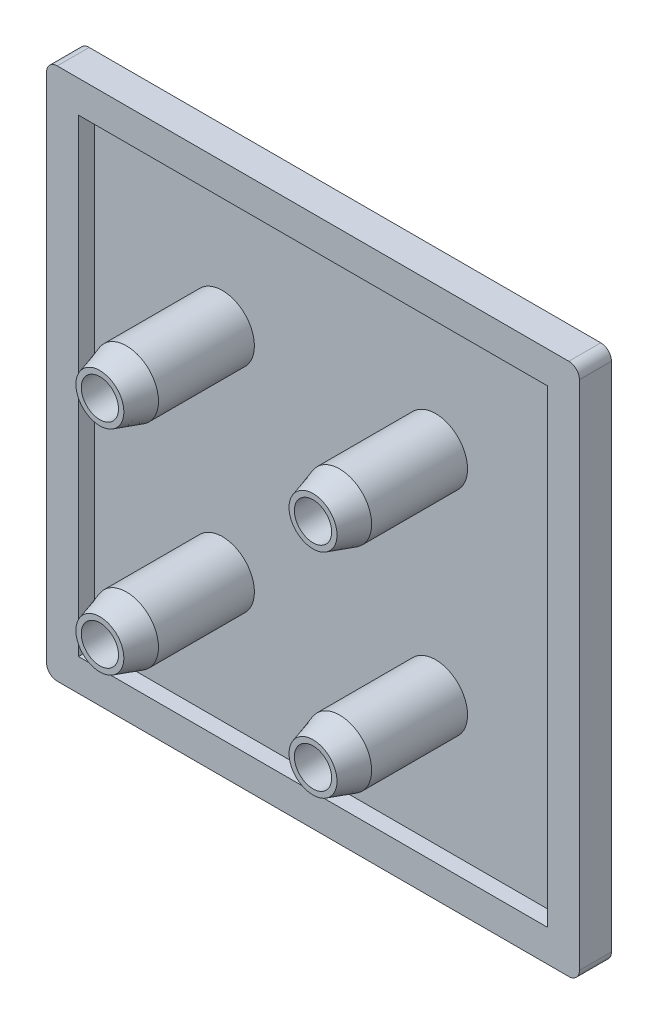
ISO-10303-21;
HEADER;
FILE_DESCRIPTION(('STEP AP214'),'2;1');
FILE_NAME('part.step','',(''),(''),'','','');
FILE_SCHEMA(('AUTOMOTIVE_DESIGN { 1 0 10303 214 1 1 1 1 }'));
ENDSEC;
DATA;
#1=APPLICATION_CONTEXT('core data for automotive mechanical design processes');
#2=APPLICATION_PROTOCOL_DEFINITION('international standard','automotive_design',2000,#1);
#3=PRODUCT_CONTEXT('',#1,'mechanical');
#4=PRODUCT('Part','Part','',(#3));
#5=PRODUCT_RELATED_PRODUCT_CATEGORY('part','',(#4));
#6=PRODUCT_DEFINITION_FORMATION('','',#4);
#7=PRODUCT_DEFINITION_CONTEXT('part definition',#1,'design');
#8=PRODUCT_DEFINITION('design','',#6,#7);
#9=PRODUCT_DEFINITION_SHAPE('','',#8);
#10=(LENGTH_UNIT() NAMED_UNIT(*) SI_UNIT(.MILLI.,.METRE.));
#11=(NAMED_UNIT(*) PLANE_ANGLE_UNIT() SI_UNIT($,.RADIAN.));
#12=(NAMED_UNIT(*) SI_UNIT($,.STERADIAN.) SOLID_ANGLE_UNIT());
#13=UNCERTAINTY_MEASURE_WITH_UNIT(LENGTH_MEASURE(1.E-05),#10,'distance_accuracy_value','');
#14=(GEOMETRIC_REPRESENTATION_CONTEXT(3) GLOBAL_UNCERTAINTY_ASSIGNED_CONTEXT((#13)) GLOBAL_UNIT_ASSIGNED_CONTEXT((#10,
#11,#12)) REPRESENTATION_CONTEXT('',''));
#15=CARTESIAN_POINT('',(0.,0.,0.));
#16=DIRECTION('',(0.,0.,1.));
#17=DIRECTION('',(1.,0.,0.));
#18=AXIS2_PLACEMENT_3D('',#15,#16,#17);
#19=CARTESIAN_POINT('',(0.,0.,-1.5));
#20=DIRECTION('',(0.,0.,1.));
#21=DIRECTION('',(1.,0.,0.));
#22=AXIS2_PLACEMENT_3D('',#19,#20,#21);
#23=PLANE('',#22);
#24=CARTESIAN_POINT('',(10.,-10.,-1.5));
#25=DIRECTION('',(0.,0.,1.));
#26=DIRECTION('',(1.,0.,0.));
#27=AXIS2_PLACEMENT_3D('',#24,#25,#26);
#28=CIRCLE('',#27,3.);
#29=CARTESIAN_POINT('',(13.,-10.,-1.5));
#30=VERTEX_POINT('',#29);
#31=EDGE_CURVE('E540',#30,#30,#28,.T.);
#32=ORIENTED_EDGE('',*,*,#31,.F.);
#33=EDGE_LOOP('',(#32));
#34=FACE_BOUND('',#33,.T.);
#35=CARTESIAN_POINT('',(-10.,10.,-1.5));
#36=DIRECTION('',(0.,0.,1.));
#37=DIRECTION('',(1.,0.,0.));
#38=AXIS2_PLACEMENT_3D('',#35,#36,#37);
#39=CIRCLE('',#38,3.);
#40=CARTESIAN_POINT('',(-7.,10.,-1.5));
#41=VERTEX_POINT('',#40);
#42=EDGE_CURVE('E570',#41,#41,#39,.T.);
#43=ORIENTED_EDGE('',*,*,#42,.F.);
#44=EDGE_LOOP('',(#43));
#45=FACE_BOUND('',#44,.T.);
#46=DIRECTION('',(0.,-1.,0.));
#47=VECTOR('',#46,1.);
#48=CARTESIAN_POINT('',(-22.,22.,-1.5));
#49=LINE('',#48,#47);
#50=CARTESIAN_POINT('',(-22.,22.,-1.5));
#51=VERTEX_POINT('',#50);
#52=CARTESIAN_POINT('',(-22.,-22.,-1.5));
#53=VERTEX_POINT('',#52);
#54=EDGE_CURVE('E242',#51,#53,#49,.T.);
#55=ORIENTED_EDGE('',*,*,#54,.T.);
#56=DIRECTION('',(1.,0.,0.));
#57=VECTOR('',#56,1.);
#58=CARTESIAN_POINT('',(-22.,-22.,-1.5));
#59=LINE('',#58,#57);
#60=CARTESIAN_POINT('',(22.,-22.,-1.5));
#61=VERTEX_POINT('',#60);
#62=EDGE_CURVE('E583',#53,#61,#59,.T.);
#63=ORIENTED_EDGE('',*,*,#62,.T.);
#64=DIRECTION('',(0.,1.,0.));
#65=VECTOR('',#64,1.);
#66=CARTESIAN_POINT('',(22.,-22.,-1.5));
#67=LINE('',#66,#65);
#68=CARTESIAN_POINT('',(22.,22.,-1.5));
#69=VERTEX_POINT('',#68);
#70=EDGE_CURVE('E585',#61,#69,#67,.T.);
#71=ORIENTED_EDGE('',*,*,#70,.T.);
#72=DIRECTION('',(-1.,0.,0.));
#73=VECTOR('',#72,1.);
#74=CARTESIAN_POINT('',(22.,22.,-1.5));
#75=LINE('',#74,#73);
#76=EDGE_CURVE('E236',#69,#51,#75,.T.);
#77=ORIENTED_EDGE('',*,*,#76,.T.);
#78=EDGE_LOOP('',(#55,#63,#71,#77));
#79=FACE_BOUND('',#78,.T.);
#80=CARTESIAN_POINT('',(10.,10.,-1.5));
#81=DIRECTION('',(0.,0.,1.));
#82=DIRECTION('',(1.,0.,0.));
#83=AXIS2_PLACEMENT_3D('',#80,#81,#82);
#84=CIRCLE('',#83,3.);
#85=CARTESIAN_POINT('',(13.,10.,-1.5));
#86=VERTEX_POINT('',#85);
#87=EDGE_CURVE('E555',#86,#86,#84,.T.);
#88=ORIENTED_EDGE('',*,*,#87,.F.);
#89=EDGE_LOOP('',(#88));
#90=FACE_BOUND('',#89,.T.);
#91=CARTESIAN_POINT('',(-10.,-10.,-1.5));
#92=DIRECTION('',(0.,0.,1.));
#93=DIRECTION('',(1.,0.,0.));
#94=AXIS2_PLACEMENT_3D('',#91,#92,#93);
#95=CIRCLE('',#94,3.);
#96=CARTESIAN_POINT('',(-7.,-10.,-1.5));
#97=VERTEX_POINT('',#96);
#98=EDGE_CURVE('E526',#97,#97,#95,.T.);
#99=ORIENTED_EDGE('',*,*,#98,.F.);
#100=EDGE_LOOP('',(#99));
#101=FACE_BOUND('',#100,.T.);
#102=ADVANCED_FACE('F35',(#34,#45,#79,#90,#101),#23,.T.);
#103=CARTESIAN_POINT('',(-24.0000000000015,24.0000000000015,-3.));
#104=DIRECTION('',(0.,0.,1.));
#105=DIRECTION('',(1.,0.,0.));
#106=AXIS2_PLACEMENT_3D('',#103,#104,#105);
#107=CYLINDRICAL_SURFACE('',#106,0.999999999998457);
#108=CARTESIAN_POINT('',(-24.0000000000015,24.0000000000015,0.));
#109=DIRECTION('',(0.,0.,1.));
#110=DIRECTION('',(1.,0.,0.));
#111=AXIS2_PLACEMENT_3D('',#108,#109,#110);
#112=CIRCLE('',#111,0.999999999998457);
#113=CARTESIAN_POINT('',(-24.,25.,0.));
#114=VERTEX_POINT('',#113);
#115=CARTESIAN_POINT('',(-25.,24.,0.));
#116=VERTEX_POINT('',#115);
#117=EDGE_CURVE('E146',#114,#116,#112,.T.);
#118=ORIENTED_EDGE('',*,*,#117,.F.);
#119=DIRECTION('',(0.,0.,1.));
#120=VECTOR('',#119,1.);
#121=CARTESIAN_POINT('',(-24.,25.,-3.));
#122=LINE('',#121,#120);
#123=CARTESIAN_POINT('',(-24.,25.,-3.));
#124=VERTEX_POINT('',#123);
#125=EDGE_CURVE('E11',#124,#114,#122,.T.);
#126=ORIENTED_EDGE('',*,*,#125,.F.);
#127=CARTESIAN_POINT('',(-24.0000000000015,24.0000000000015,-3.));
#128=DIRECTION('',(0.,0.,1.));
#129=DIRECTION('',(1.,0.,0.));
#130=AXIS2_PLACEMENT_3D('',#127,#128,#129);
#131=CIRCLE('',#130,0.999999999998457);
#132=CARTESIAN_POINT('',(-25.,24.,-3.));
#133=VERTEX_POINT('',#132);
#134=EDGE_CURVE('E167',#124,#133,#131,.T.);
#135=ORIENTED_EDGE('',*,*,#134,.T.);
#136=DIRECTION('',(0.,0.,1.));
#137=VECTOR('',#136,1.);
#138=CARTESIAN_POINT('',(-25.,24.,-3.));
#139=LINE('',#138,#137);
#140=EDGE_CURVE('E39',#133,#116,#139,.T.);
#141=ORIENTED_EDGE('',*,*,#140,.T.);
#142=EDGE_LOOP('',(#118,#126,#135,#141));
#143=FACE_BOUND('',#142,.T.);
#144=ADVANCED_FACE('F37',(#143),#107,.T.);
#145=CARTESIAN_POINT('',(24.,25.,-3.));
#146=DIRECTION('',(0.,1.,0.));
#147=DIRECTION('',(0.,0.,1.));
#148=AXIS2_PLACEMENT_3D('',#145,#146,#147);
#149=PLANE('',#148);
#150=DIRECTION('',(-1.,0.,0.));
#151=VECTOR('',#150,1.);
#152=CARTESIAN_POINT('',(24.,25.,0.));
#153=LINE('',#152,#151);
#154=CARTESIAN_POINT('',(24.,25.,0.));
#155=VERTEX_POINT('',#154);
#156=EDGE_CURVE('E165',#155,#114,#153,.T.);
#157=ORIENTED_EDGE('',*,*,#156,.F.);
#158=DIRECTION('',(0.,0.,1.));
#159=VECTOR('',#158,1.);
#160=CARTESIAN_POINT('',(24.,25.,-3.));
#161=LINE('',#160,#159);
#162=CARTESIAN_POINT('',(24.,25.,-3.));
#163=VERTEX_POINT('',#162);
#164=EDGE_CURVE('E44',#163,#155,#161,.T.);
#165=ORIENTED_EDGE('',*,*,#164,.F.);
#166=DIRECTION('',(-1.,0.,0.));
#167=VECTOR('',#166,1.);
#168=CARTESIAN_POINT('',(24.,25.,-3.));
#169=LINE('',#168,#167);
#170=EDGE_CURVE('E136',#163,#124,#169,.T.);
#171=ORIENTED_EDGE('',*,*,#170,.T.);
#172=ORIENTED_EDGE('',*,*,#125,.T.);
#173=EDGE_LOOP('',(#157,#165,#171,#172));
#174=FACE_BOUND('',#173,.T.);
#175=ADVANCED_FACE('F179',(#174),#149,.T.);
#176=CARTESIAN_POINT('',(24.0000000000015,24.0000000000015,-3.));
#177=DIRECTION('',(0.,0.,1.));
#178=DIRECTION('',(1.,0.,0.));
#179=AXIS2_PLACEMENT_3D('',#176,#177,#178);
#180=CYLINDRICAL_SURFACE('',#179,0.999999999998457);
#181=CARTESIAN_POINT('',(24.0000000000015,24.0000000000015,0.));
#182=DIRECTION('',(0.,0.,1.));
#183=DIRECTION('',(1.,0.,0.));
#184=AXIS2_PLACEMENT_3D('',#181,#182,#183);
#185=CIRCLE('',#184,0.999999999998457);
#186=CARTESIAN_POINT('',(25.,24.,0.));
#187=VERTEX_POINT('',#186);
#188=EDGE_CURVE('E123',#187,#155,#185,.T.);
#189=ORIENTED_EDGE('',*,*,#188,.F.);
#190=DIRECTION('',(0.,0.,1.));
#191=VECTOR('',#190,1.);
#192=CARTESIAN_POINT('',(25.,24.,-3.));
#193=LINE('',#192,#191);
#194=CARTESIAN_POINT('',(25.,24.,-3.));
#195=VERTEX_POINT('',#194);
#196=EDGE_CURVE('E117',#195,#187,#193,.T.);
#197=ORIENTED_EDGE('',*,*,#196,.F.);
#198=CARTESIAN_POINT('',(24.0000000000015,24.0000000000015,-3.));
#199=DIRECTION('',(0.,0.,1.));
#200=DIRECTION('',(1.,0.,0.));
#201=AXIS2_PLACEMENT_3D('',#198,#199,#200);
#202=CIRCLE('',#201,0.999999999998457);
#203=EDGE_CURVE('E120',#195,#163,#202,.T.);
#204=ORIENTED_EDGE('',*,*,#203,.T.);
#205=ORIENTED_EDGE('',*,*,#164,.T.);
#206=EDGE_LOOP('',(#189,#197,#204,#205));
#207=FACE_BOUND('',#206,.T.);
#208=ADVANCED_FACE('F119',(#207),#180,.T.);
#209=CARTESIAN_POINT('',(25.,-24.,-3.));
#210=DIRECTION('',(1.,0.,0.));
#211=DIRECTION('',(0.,0.,-1.));
#212=AXIS2_PLACEMENT_3D('',#209,#210,#211);
#213=PLANE('',#212);
#214=DIRECTION('',(0.,1.,0.));
#215=VECTOR('',#214,1.);
#216=CARTESIAN_POINT('',(25.,-24.,0.));
#217=LINE('',#216,#215);
#218=CARTESIAN_POINT('',(25.,-24.,0.));
#219=VERTEX_POINT('',#218);
#220=EDGE_CURVE('E162',#219,#187,#217,.T.);
#221=ORIENTED_EDGE('',*,*,#220,.F.);
#222=DIRECTION('',(0.,0.,1.));
#223=VECTOR('',#222,1.);
#224=CARTESIAN_POINT('',(25.,-24.,-3.));
#225=LINE('',#224,#223);
#226=CARTESIAN_POINT('',(25.,-24.,-3.));
#227=VERTEX_POINT('',#226);
#228=EDGE_CURVE('E128',#227,#219,#225,.T.);
#229=ORIENTED_EDGE('',*,*,#228,.F.);
#230=DIRECTION('',(0.,1.,0.));
#231=VECTOR('',#230,1.);
#232=CARTESIAN_POINT('',(25.,-24.,-3.));
#233=LINE('',#232,#231);
#234=EDGE_CURVE('E134',#227,#195,#233,.T.);
#235=ORIENTED_EDGE('',*,*,#234,.T.);
#236=ORIENTED_EDGE('',*,*,#196,.T.);
#237=EDGE_LOOP('',(#221,#229,#235,#236));
#238=FACE_BOUND('',#237,.T.);
#239=ADVANCED_FACE('F138',(#238),#213,.T.);
#240=CARTESIAN_POINT('',(24.0000000000015,-24.0000000000015,-3.));
#241=DIRECTION('',(0.,0.,1.));
#242=DIRECTION('',(1.,0.,0.));
#243=AXIS2_PLACEMENT_3D('',#240,#241,#242);
#244=CYLINDRICAL_SURFACE('',#243,0.999999999998457);
#245=CARTESIAN_POINT('',(24.0000000000015,-24.0000000000015,0.));
#246=DIRECTION('',(0.,0.,1.));
#247=DIRECTION('',(1.,0.,0.));
#248=AXIS2_PLACEMENT_3D('',#245,#246,#247);
#249=CIRCLE('',#248,0.999999999998457);
#250=CARTESIAN_POINT('',(24.,-25.,0.));
#251=VERTEX_POINT('',#250);
#252=EDGE_CURVE('E159',#251,#219,#249,.T.);
#253=ORIENTED_EDGE('',*,*,#252,.F.);
#254=DIRECTION('',(0.,0.,1.));
#255=VECTOR('',#254,1.);
#256=CARTESIAN_POINT('',(24.,-25.,-3.));
#257=LINE('',#256,#255);
#258=CARTESIAN_POINT('',(24.,-25.,-3.));
#259=VERTEX_POINT('',#258);
#260=EDGE_CURVE('E171',#259,#251,#257,.T.);
#261=ORIENTED_EDGE('',*,*,#260,.F.);
#262=CARTESIAN_POINT('',(24.0000000000015,-24.0000000000015,-3.));
#263=DIRECTION('',(0.,0.,1.));
#264=DIRECTION('',(1.,0.,0.));
#265=AXIS2_PLACEMENT_3D('',#262,#263,#264);
#266=CIRCLE('',#265,0.999999999998457);
#267=EDGE_CURVE('E139',#259,#227,#266,.T.);
#268=ORIENTED_EDGE('',*,*,#267,.T.);
#269=ORIENTED_EDGE('',*,*,#228,.T.);
#270=EDGE_LOOP('',(#253,#261,#268,#269));
#271=FACE_BOUND('',#270,.T.);
#272=ADVANCED_FACE('F267',(#271),#244,.T.);
#273=CARTESIAN_POINT('',(-24.,-25.,-3.));
#274=DIRECTION('',(0.,-1.,0.));
#275=DIRECTION('',(0.,0.,-1.));
#276=AXIS2_PLACEMENT_3D('',#273,#274,#275);
#277=PLANE('',#276);
#278=DIRECTION('',(1.,0.,0.));
#279=VECTOR('',#278,1.);
#280=CARTESIAN_POINT('',(-24.,-25.,0.));
#281=LINE('',#280,#279);
#282=CARTESIAN_POINT('',(-24.,-25.,0.));
#283=VERTEX_POINT('',#282);
#284=EDGE_CURVE('E156',#283,#251,#281,.T.);
#285=ORIENTED_EDGE('',*,*,#284,.F.);
#286=DIRECTION('',(0.,0.,1.));
#287=VECTOR('',#286,1.);
#288=CARTESIAN_POINT('',(-24.,-25.,-3.));
#289=LINE('',#288,#287);
#290=CARTESIAN_POINT('',(-24.,-25.,-3.));
#291=VERTEX_POINT('',#290);
#292=EDGE_CURVE('E173',#291,#283,#289,.T.);
#293=ORIENTED_EDGE('',*,*,#292,.F.);
#294=DIRECTION('',(1.,0.,0.));
#295=VECTOR('',#294,1.);
#296=CARTESIAN_POINT('',(-24.,-25.,-3.));
#297=LINE('',#296,#295);
#298=EDGE_CURVE('E141',#291,#259,#297,.T.);
#299=ORIENTED_EDGE('',*,*,#298,.T.);
#300=ORIENTED_EDGE('',*,*,#260,.T.);
#301=EDGE_LOOP('',(#285,#293,#299,#300));
#302=FACE_BOUND('',#301,.T.);
#303=ADVANCED_FACE('F261',(#302),#277,.T.);
#304=CARTESIAN_POINT('',(-24.0000000000015,-24.0000000000015,-3.));
#305=DIRECTION('',(0.,0.,1.));
#306=DIRECTION('',(1.,0.,0.));
#307=AXIS2_PLACEMENT_3D('',#304,#305,#306);
#308=CYLINDRICAL_SURFACE('',#307,0.999999999998457);
#309=CARTESIAN_POINT('',(-24.0000000000015,-24.0000000000015,0.));
#310=DIRECTION('',(0.,0.,1.));
#311=DIRECTION('',(1.,0.,0.));
#312=AXIS2_PLACEMENT_3D('',#309,#310,#311);
#313=CIRCLE('',#312,0.999999999998457);
#314=CARTESIAN_POINT('',(-25.,-24.,0.));
#315=VERTEX_POINT('',#314);
#316=EDGE_CURVE('E153',#315,#283,#313,.T.);
#317=ORIENTED_EDGE('',*,*,#316,.F.);
#318=DIRECTION('',(0.,0.,1.));
#319=VECTOR('',#318,1.);
#320=CARTESIAN_POINT('',(-25.,-24.,-3.));
#321=LINE('',#320,#319);
#322=CARTESIAN_POINT('',(-25.,-24.,-3.));
#323=VERTEX_POINT('',#322);
#324=EDGE_CURVE('E174',#323,#315,#321,.T.);
#325=ORIENTED_EDGE('',*,*,#324,.F.);
#326=CARTESIAN_POINT('',(-24.0000000000015,-24.0000000000015,-3.));
#327=DIRECTION('',(0.,0.,1.));
#328=DIRECTION('',(1.,0.,0.));
#329=AXIS2_PLACEMENT_3D('',#326,#327,#328);
#330=CIRCLE('',#329,0.999999999998457);
#331=EDGE_CURVE('E255',#323,#291,#330,.T.);
#332=ORIENTED_EDGE('',*,*,#331,.T.);
#333=ORIENTED_EDGE('',*,*,#292,.T.);
#334=EDGE_LOOP('',(#317,#325,#332,#333));
#335=FACE_BOUND('',#334,.T.);
#336=ADVANCED_FACE('F265',(#335),#308,.T.);
#337=CARTESIAN_POINT('',(-25.,24.,-3.));
#338=DIRECTION('',(-1.,0.,0.));
#339=DIRECTION('',(0.,0.,1.));
#340=AXIS2_PLACEMENT_3D('',#337,#338,#339);
#341=PLANE('',#340);
#342=DIRECTION('',(0.,-1.,0.));
#343=VECTOR('',#342,1.);
#344=CARTESIAN_POINT('',(-25.,24.,0.));
#345=LINE('',#344,#343);
#346=EDGE_CURVE('E149',#116,#315,#345,.T.);
#347=ORIENTED_EDGE('',*,*,#346,.F.);
#348=ORIENTED_EDGE('',*,*,#140,.F.);
#349=DIRECTION('',(0.,-1.,0.));
#350=VECTOR('',#349,1.);
#351=CARTESIAN_POINT('',(-25.,24.,-3.));
#352=LINE('',#351,#350);
#353=EDGE_CURVE('E253',#133,#323,#352,.T.);
#354=ORIENTED_EDGE('',*,*,#353,.T.);
#355=ORIENTED_EDGE('',*,*,#324,.T.);
#356=EDGE_LOOP('',(#347,#348,#354,#355));
#357=FACE_BOUND('',#356,.T.);
#358=ADVANCED_FACE('F176',(#357),#341,.T.);
#359=CARTESIAN_POINT('',(-24.0000000000015,24.0000000000015,-3.));
#360=DIRECTION('',(0.,0.,1.));
#361=DIRECTION('',(1.,0.,0.));
#362=AXIS2_PLACEMENT_3D('',#359,#360,#361);
#363=PLANE('',#362);
#364=ORIENTED_EDGE('',*,*,#134,.F.);
#365=ORIENTED_EDGE('',*,*,#170,.F.);
#366=ORIENTED_EDGE('',*,*,#203,.F.);
#367=ORIENTED_EDGE('',*,*,#234,.F.);
#368=ORIENTED_EDGE('',*,*,#267,.F.);
#369=ORIENTED_EDGE('',*,*,#298,.F.);
#370=ORIENTED_EDGE('',*,*,#331,.F.);
#371=ORIENTED_EDGE('',*,*,#353,.F.);
#372=EDGE_LOOP('',(#364,#365,#366,#367,#368,#369,#370,#371));
#373=FACE_BOUND('',#372,.T.);
#374=ADVANCED_FACE('F132',(#373),#363,.F.);
#375=CARTESIAN_POINT('',(-24.0000000000015,24.0000000000015,0.));
#376=DIRECTION('',(0.,0.,1.));
#377=DIRECTION('',(1.,0.,0.));
#378=AXIS2_PLACEMENT_3D('',#375,#376,#377);
#379=PLANE('',#378);
#380=DIRECTION('',(0.,-1.,0.));
#381=VECTOR('',#380,1.);
#382=CARTESIAN_POINT('',(-22.,22.,0.));
#383=LINE('',#382,#381);
#384=CARTESIAN_POINT('',(-22.,22.,0.));
#385=VERTEX_POINT('',#384);
#386=CARTESIAN_POINT('',(-22.,-22.,0.));
#387=VERTEX_POINT('',#386);
#388=EDGE_CURVE('E52',#385,#387,#383,.T.);
#389=ORIENTED_EDGE('',*,*,#388,.F.);
#390=DIRECTION('',(-1.,0.,0.));
#391=VECTOR('',#390,1.);
#392=CARTESIAN_POINT('',(22.,22.,0.));
#393=LINE('',#392,#391);
#394=CARTESIAN_POINT('',(22.,22.,0.));
#395=VERTEX_POINT('',#394);
#396=EDGE_CURVE('E224',#395,#385,#393,.T.);
#397=ORIENTED_EDGE('',*,*,#396,.F.);
#398=DIRECTION('',(0.,1.,0.));
#399=VECTOR('',#398,1.);
#400=CARTESIAN_POINT('',(22.,-22.,0.));
#401=LINE('',#400,#399);
#402=CARTESIAN_POINT('',(22.,-22.,0.));
#403=VERTEX_POINT('',#402);
#404=EDGE_CURVE('E230',#403,#395,#401,.T.);
#405=ORIENTED_EDGE('',*,*,#404,.F.);
#406=DIRECTION('',(1.,0.,0.));
#407=VECTOR('',#406,1.);
#408=CARTESIAN_POINT('',(-22.,-22.,0.));
#409=LINE('',#408,#407);
#410=EDGE_CURVE('E226',#387,#403,#409,.T.);
#411=ORIENTED_EDGE('',*,*,#410,.F.);
#412=EDGE_LOOP('',(#389,#397,#405,#411));
#413=FACE_BOUND('',#412,.T.);
#414=ORIENTED_EDGE('',*,*,#117,.T.);
#415=ORIENTED_EDGE('',*,*,#346,.T.);
#416=ORIENTED_EDGE('',*,*,#316,.T.);
#417=ORIENTED_EDGE('',*,*,#284,.T.);
#418=ORIENTED_EDGE('',*,*,#252,.T.);
#419=ORIENTED_EDGE('',*,*,#220,.T.);
#420=ORIENTED_EDGE('',*,*,#188,.T.);
#421=ORIENTED_EDGE('',*,*,#156,.T.);
#422=EDGE_LOOP('',(#414,#415,#416,#417,#418,#419,#420,#421));
#423=FACE_BOUND('',#422,.T.);
#424=ADVANCED_FACE('F178',(#413,#423),#379,.T.);
#425=CARTESIAN_POINT('',(-22.,22.,-1.5));
#426=DIRECTION('',(-1.,0.,0.));
#427=DIRECTION('',(0.,0.,1.));
#428=AXIS2_PLACEMENT_3D('',#425,#426,#427);
#429=PLANE('',#428);
#430=ORIENTED_EDGE('',*,*,#388,.T.);
#431=DIRECTION('',(0.,0.,1.));
#432=VECTOR('',#431,1.);
#433=CARTESIAN_POINT('',(-22.,-22.,-1.5));
#434=LINE('',#433,#432);
#435=EDGE_CURVE('E250',#53,#387,#434,.T.);
#436=ORIENTED_EDGE('',*,*,#435,.F.);
#437=ORIENTED_EDGE('',*,*,#54,.F.);
#438=DIRECTION('',(0.,0.,1.));
#439=VECTOR('',#438,1.);
#440=CARTESIAN_POINT('',(-22.,22.,-1.5));
#441=LINE('',#440,#439);
#442=EDGE_CURVE('E150',#51,#385,#441,.T.);
#443=ORIENTED_EDGE('',*,*,#442,.T.);
#444=EDGE_LOOP('',(#430,#436,#437,#443));
#445=FACE_BOUND('',#444,.T.);
#446=ADVANCED_FACE('F203',(#445),#429,.F.);
#447=CARTESIAN_POINT('',(22.,22.,-1.5));
#448=DIRECTION('',(0.,1.,0.));
#449=DIRECTION('',(0.,0.,1.));
#450=AXIS2_PLACEMENT_3D('',#447,#448,#449);
#451=PLANE('',#450);
#452=ORIENTED_EDGE('',*,*,#396,.T.);
#453=ORIENTED_EDGE('',*,*,#442,.F.);
#454=ORIENTED_EDGE('',*,*,#76,.F.);
#455=DIRECTION('',(0.,0.,1.));
#456=VECTOR('',#455,1.);
#457=CARTESIAN_POINT('',(22.,22.,-1.5));
#458=LINE('',#457,#456);
#459=EDGE_CURVE('E244',#69,#395,#458,.T.);
#460=ORIENTED_EDGE('',*,*,#459,.T.);
#461=EDGE_LOOP('',(#452,#453,#454,#460));
#462=FACE_BOUND('',#461,.T.);
#463=ADVANCED_FACE('F199',(#462),#451,.F.);
#464=CARTESIAN_POINT('',(22.,-22.,-1.5));
#465=DIRECTION('',(1.,0.,0.));
#466=DIRECTION('',(0.,0.,-1.));
#467=AXIS2_PLACEMENT_3D('',#464,#465,#466);
#468=PLANE('',#467);
#469=ORIENTED_EDGE('',*,*,#404,.T.);
#470=ORIENTED_EDGE('',*,*,#459,.F.);
#471=ORIENTED_EDGE('',*,*,#70,.F.);
#472=DIRECTION('',(0.,0.,1.));
#473=VECTOR('',#472,1.);
#474=CARTESIAN_POINT('',(22.,-22.,-1.5));
#475=LINE('',#474,#473);
#476=EDGE_CURVE('E247',#61,#403,#475,.T.);
#477=ORIENTED_EDGE('',*,*,#476,.T.);
#478=EDGE_LOOP('',(#469,#470,#471,#477));
#479=FACE_BOUND('',#478,.T.);
#480=ADVANCED_FACE('F202',(#479),#468,.F.);
#481=CARTESIAN_POINT('',(-22.,-22.,-1.5));
#482=DIRECTION('',(0.,-1.,0.));
#483=DIRECTION('',(0.,0.,-1.));
#484=AXIS2_PLACEMENT_3D('',#481,#482,#483);
#485=PLANE('',#484);
#486=ORIENTED_EDGE('',*,*,#410,.T.);
#487=ORIENTED_EDGE('',*,*,#476,.F.);
#488=ORIENTED_EDGE('',*,*,#62,.F.);
#489=ORIENTED_EDGE('',*,*,#435,.T.);
#490=EDGE_LOOP('',(#486,#487,#488,#489));
#491=FACE_BOUND('',#490,.T.);
#492=ADVANCED_FACE('F207',(#491),#485,.F.);
#493=CARTESIAN_POINT('',(-10.,10.,0.));
#494=DIRECTION('',(0.,0.,-1.));
#495=DIRECTION('',(-1.,0.,0.));
#496=AXIS2_PLACEMENT_3D('',#493,#494,#495);
#497=PLANE('',#496);
#498=CARTESIAN_POINT('',(-10.,10.,0.));
#499=DIRECTION('',(0.,0.,1.));
#500=DIRECTION('',(1.,0.,0.));
#501=AXIS2_PLACEMENT_3D('',#498,#499,#500);
#502=CIRCLE('',#501,1.75);
#503=CARTESIAN_POINT('',(-8.25,10.,0.));
#504=VERTEX_POINT('',#503);
#505=EDGE_CURVE('E228',#504,#504,#502,.T.);
#506=ORIENTED_EDGE('',*,*,#505,.T.);
#507=EDGE_LOOP('',(#506));
#508=FACE_BOUND('',#507,.T.);
#509=ADVANCED_FACE('F197',(#508),#497,.F.);
#510=CARTESIAN_POINT('',(-10.,10.,-1.5));
#511=DIRECTION('',(0.,0.,1.));
#512=DIRECTION('',(1.,0.,0.));
#513=AXIS2_PLACEMENT_3D('',#510,#511,#512);
#514=CYLINDRICAL_SURFACE('',#513,1.75);
#515=ORIENTED_EDGE('',*,*,#505,.F.);
#516=EDGE_LOOP('',(#515));
#517=FACE_BOUND('',#516,.T.);
#518=CARTESIAN_POINT('',(-10.,10.,10.));
#519=DIRECTION('',(0.,0.,1.));
#520=DIRECTION('',(1.,0.,0.));
#521=AXIS2_PLACEMENT_3D('',#518,#519,#520);
#522=CIRCLE('',#521,1.75);
#523=CARTESIAN_POINT('',(-8.25,10.,10.));
#524=VERTEX_POINT('',#523);
#525=EDGE_CURVE('E233',#524,#524,#522,.T.);
#526=ORIENTED_EDGE('',*,*,#525,.T.);
#527=EDGE_LOOP('',(#526));
#528=FACE_BOUND('',#527,.T.);
#529=ADVANCED_FACE('F324',(#517,#528),#514,.F.);
#530=CARTESIAN_POINT('',(-10.,11.75,10.));
#531=DIRECTION('',(0.,0.,-1.));
#532=DIRECTION('',(-1.,0.,0.));
#533=AXIS2_PLACEMENT_3D('',#530,#531,#532);
#534=PLANE('',#533);
#535=ORIENTED_EDGE('',*,*,#525,.F.);
#536=EDGE_LOOP('',(#535));
#537=FACE_BOUND('',#536,.T.);
#538=CARTESIAN_POINT('',(-10.,10.,10.));
#539=DIRECTION('',(0.,0.,1.));
#540=DIRECTION('',(1.,0.,0.));
#541=AXIS2_PLACEMENT_3D('',#538,#539,#540);
#542=CIRCLE('',#541,2.25);
#543=CARTESIAN_POINT('',(-7.75,10.,10.));
#544=VERTEX_POINT('',#543);
#545=EDGE_CURVE('E576',#544,#544,#542,.T.);
#546=ORIENTED_EDGE('',*,*,#545,.T.);
#547=EDGE_LOOP('',(#546));
#548=FACE_BOUND('',#547,.T.);
#549=ADVANCED_FACE('F333',(#537,#548),#534,.F.);
#550=CARTESIAN_POINT('',(-10.,10.,7.5));
#551=DIRECTION('',(0.,0.,-1.));
#552=DIRECTION('',(-1.,0.,0.));
#553=AXIS2_PLACEMENT_3D('',#550,#551,#552);
#554=CONICAL_SURFACE('',#553,3.,0.291456794477867);
#555=ORIENTED_EDGE('',*,*,#545,.F.);
#556=EDGE_LOOP('',(#555));
#557=FACE_BOUND('',#556,.T.);
#558=CARTESIAN_POINT('',(-10.,10.,7.5));
#559=DIRECTION('',(0.,0.,1.));
#560=DIRECTION('',(1.,0.,0.));
#561=AXIS2_PLACEMENT_3D('',#558,#559,#560);
#562=CIRCLE('',#561,3.);
#563=CARTESIAN_POINT('',(-7.,10.,7.5));
#564=VERTEX_POINT('',#563);
#565=EDGE_CURVE('E573',#564,#564,#562,.T.);
#566=ORIENTED_EDGE('',*,*,#565,.T.);
#567=EDGE_LOOP('',(#566));
#568=FACE_BOUND('',#567,.T.);
#569=ADVANCED_FACE('F342',(#557,#568),#554,.T.);
#570=CARTESIAN_POINT('',(-10.,10.,-1.5));
#571=DIRECTION('',(0.,0.,1.));
#572=DIRECTION('',(1.,0.,0.));
#573=AXIS2_PLACEMENT_3D('',#570,#571,#572);
#574=CYLINDRICAL_SURFACE('',#573,3.);
#575=ORIENTED_EDGE('',*,*,#565,.F.);
#576=EDGE_LOOP('',(#575));
#577=FACE_BOUND('',#576,.T.);
#578=ORIENTED_EDGE('',*,*,#42,.T.);
#579=EDGE_LOOP('',(#578));
#580=FACE_BOUND('',#579,.T.);
#581=ADVANCED_FACE('F352',(#577,#580),#574,.T.);
#582=CARTESIAN_POINT('',(10.,10.,0.));
#583=DIRECTION('',(0.,0.,-1.));
#584=DIRECTION('',(-1.,0.,0.));
#585=AXIS2_PLACEMENT_3D('',#582,#583,#584);
#586=PLANE('',#585);
#587=CARTESIAN_POINT('',(10.,10.,0.));
#588=DIRECTION('',(0.,0.,1.));
#589=DIRECTION('',(1.,0.,0.));
#590=AXIS2_PLACEMENT_3D('',#587,#588,#589);
#591=CIRCLE('',#590,1.75);
#592=CARTESIAN_POINT('',(11.75,10.,0.));
#593=VERTEX_POINT('',#592);
#594=EDGE_CURVE('E567',#593,#593,#591,.T.);
#595=ORIENTED_EDGE('',*,*,#594,.T.);
#596=EDGE_LOOP('',(#595));
#597=FACE_BOUND('',#596,.T.);
#598=ADVANCED_FACE('F362',(#597),#586,.F.);
#599=CARTESIAN_POINT('',(10.,10.,-1.5));
#600=DIRECTION('',(0.,0.,1.));
#601=DIRECTION('',(1.,0.,0.));
#602=AXIS2_PLACEMENT_3D('',#599,#600,#601);
#603=CYLINDRICAL_SURFACE('',#602,1.75);
#604=ORIENTED_EDGE('',*,*,#594,.F.);
#605=EDGE_LOOP('',(#604));
#606=FACE_BOUND('',#605,.T.);
#607=CARTESIAN_POINT('',(10.,10.,10.));
#608=DIRECTION('',(0.,0.,1.));
#609=DIRECTION('',(1.,0.,0.));
#610=AXIS2_PLACEMENT_3D('',#607,#608,#609);
#611=CIRCLE('',#610,1.75);
#612=CARTESIAN_POINT('',(11.75,10.,10.));
#613=VERTEX_POINT('',#612);
#614=EDGE_CURVE('E564',#613,#613,#611,.T.);
#615=ORIENTED_EDGE('',*,*,#614,.T.);
#616=EDGE_LOOP('',(#615));
#617=FACE_BOUND('',#616,.T.);
#618=ADVANCED_FACE('F372',(#606,#617),#603,.F.);
#619=CARTESIAN_POINT('',(10.,11.75,10.));
#620=DIRECTION('',(0.,0.,-1.));
#621=DIRECTION('',(-1.,0.,0.));
#622=AXIS2_PLACEMENT_3D('',#619,#620,#621);
#623=PLANE('',#622);
#624=ORIENTED_EDGE('',*,*,#614,.F.);
#625=EDGE_LOOP('',(#624));
#626=FACE_BOUND('',#625,.T.);
#627=CARTESIAN_POINT('',(10.,10.,10.));
#628=DIRECTION('',(0.,0.,1.));
#629=DIRECTION('',(1.,0.,0.));
#630=AXIS2_PLACEMENT_3D('',#627,#628,#629);
#631=CIRCLE('',#630,2.25);
#632=CARTESIAN_POINT('',(12.25,10.,10.));
#633=VERTEX_POINT('',#632);
#634=EDGE_CURVE('E561',#633,#633,#631,.T.);
#635=ORIENTED_EDGE('',*,*,#634,.T.);
#636=EDGE_LOOP('',(#635));
#637=FACE_BOUND('',#636,.T.);
#638=ADVANCED_FACE('F382',(#626,#637),#623,.F.);
#639=CARTESIAN_POINT('',(10.,10.,7.5));
#640=DIRECTION('',(0.,0.,-1.));
#641=DIRECTION('',(-1.,0.,0.));
#642=AXIS2_PLACEMENT_3D('',#639,#640,#641);
#643=CONICAL_SURFACE('',#642,3.,0.291456794477867);
#644=ORIENTED_EDGE('',*,*,#634,.F.);
#645=EDGE_LOOP('',(#644));
#646=FACE_BOUND('',#645,.T.);
#647=CARTESIAN_POINT('',(10.,10.,7.5));
#648=DIRECTION('',(0.,0.,1.));
#649=DIRECTION('',(1.,0.,0.));
#650=AXIS2_PLACEMENT_3D('',#647,#648,#649);
#651=CIRCLE('',#650,3.);
#652=CARTESIAN_POINT('',(13.,10.,7.5));
#653=VERTEX_POINT('',#652);
#654=EDGE_CURVE('E558',#653,#653,#651,.T.);
#655=ORIENTED_EDGE('',*,*,#654,.T.);
#656=EDGE_LOOP('',(#655));
#657=FACE_BOUND('',#656,.T.);
#658=ADVANCED_FACE('F392',(#646,#657),#643,.T.);
#659=CARTESIAN_POINT('',(10.,10.,-1.5));
#660=DIRECTION('',(0.,0.,1.));
#661=DIRECTION('',(1.,0.,0.));
#662=AXIS2_PLACEMENT_3D('',#659,#660,#661);
#663=CYLINDRICAL_SURFACE('',#662,3.);
#664=ORIENTED_EDGE('',*,*,#654,.F.);
#665=EDGE_LOOP('',(#664));
#666=FACE_BOUND('',#665,.T.);
#667=ORIENTED_EDGE('',*,*,#87,.T.);
#668=EDGE_LOOP('',(#667));
#669=FACE_BOUND('',#668,.T.);
#670=ADVANCED_FACE('F402',(#666,#669),#663,.T.);
#671=CARTESIAN_POINT('',(10.,-10.,0.));
#672=DIRECTION('',(0.,0.,-1.));
#673=DIRECTION('',(-1.,0.,0.));
#674=AXIS2_PLACEMENT_3D('',#671,#672,#673);
#675=PLANE('',#674);
#676=CARTESIAN_POINT('',(10.,-10.,0.));
#677=DIRECTION('',(0.,0.,1.));
#678=DIRECTION('',(1.,0.,0.));
#679=AXIS2_PLACEMENT_3D('',#676,#677,#678);
#680=CIRCLE('',#679,1.75);
#681=CARTESIAN_POINT('',(11.75,-10.,0.));
#682=VERTEX_POINT('',#681);
#683=EDGE_CURVE('E552',#682,#682,#680,.T.);
#684=ORIENTED_EDGE('',*,*,#683,.T.);
#685=EDGE_LOOP('',(#684));
#686=FACE_BOUND('',#685,.T.);
#687=ADVANCED_FACE('F412',(#686),#675,.F.);
#688=CARTESIAN_POINT('',(10.,-10.,-1.5));
#689=DIRECTION('',(0.,0.,1.));
#690=DIRECTION('',(1.,0.,0.));
#691=AXIS2_PLACEMENT_3D('',#688,#689,#690);
#692=CYLINDRICAL_SURFACE('',#691,1.75);
#693=ORIENTED_EDGE('',*,*,#683,.F.);
#694=EDGE_LOOP('',(#693));
#695=FACE_BOUND('',#694,.T.);
#696=CARTESIAN_POINT('',(10.,-10.,10.));
#697=DIRECTION('',(0.,0.,1.));
#698=DIRECTION('',(1.,0.,0.));
#699=AXIS2_PLACEMENT_3D('',#696,#697,#698);
#700=CIRCLE('',#699,1.75);
#701=CARTESIAN_POINT('',(11.75,-10.,10.));
#702=VERTEX_POINT('',#701);
#703=EDGE_CURVE('E549',#702,#702,#700,.T.);
#704=ORIENTED_EDGE('',*,*,#703,.T.);
#705=EDGE_LOOP('',(#704));
#706=FACE_BOUND('',#705,.T.);
#707=ADVANCED_FACE('F422',(#695,#706),#692,.F.);
#708=CARTESIAN_POINT('',(10.,-8.25,10.));
#709=DIRECTION('',(0.,0.,-1.));
#710=DIRECTION('',(-1.,0.,0.));
#711=AXIS2_PLACEMENT_3D('',#708,#709,#710);
#712=PLANE('',#711);
#713=ORIENTED_EDGE('',*,*,#703,.F.);
#714=EDGE_LOOP('',(#713));
#715=FACE_BOUND('',#714,.T.);
#716=CARTESIAN_POINT('',(10.,-10.,10.));
#717=DIRECTION('',(0.,0.,1.));
#718=DIRECTION('',(1.,0.,0.));
#719=AXIS2_PLACEMENT_3D('',#716,#717,#718);
#720=CIRCLE('',#719,2.25);
#721=CARTESIAN_POINT('',(12.25,-10.,10.));
#722=VERTEX_POINT('',#721);
#723=EDGE_CURVE('E546',#722,#722,#720,.T.);
#724=ORIENTED_EDGE('',*,*,#723,.T.);
#725=EDGE_LOOP('',(#724));
#726=FACE_BOUND('',#725,.T.);
#727=ADVANCED_FACE('F432',(#715,#726),#712,.F.);
#728=CARTESIAN_POINT('',(10.,-10.,7.5));
#729=DIRECTION('',(0.,0.,-1.));
#730=DIRECTION('',(-1.,0.,0.));
#731=AXIS2_PLACEMENT_3D('',#728,#729,#730);
#732=CONICAL_SURFACE('',#731,3.,0.291456794477867);
#733=ORIENTED_EDGE('',*,*,#723,.F.);
#734=EDGE_LOOP('',(#733));
#735=FACE_BOUND('',#734,.T.);
#736=CARTESIAN_POINT('',(10.,-10.,7.5));
#737=DIRECTION('',(0.,0.,1.));
#738=DIRECTION('',(1.,0.,0.));
#739=AXIS2_PLACEMENT_3D('',#736,#737,#738);
#740=CIRCLE('',#739,3.);
#741=CARTESIAN_POINT('',(13.,-10.,7.5));
#742=VERTEX_POINT('',#741);
#743=EDGE_CURVE('E543',#742,#742,#740,.T.);
#744=ORIENTED_EDGE('',*,*,#743,.T.);
#745=EDGE_LOOP('',(#744));
#746=FACE_BOUND('',#745,.T.);
#747=ADVANCED_FACE('F442',(#735,#746),#732,.T.);
#748=CARTESIAN_POINT('',(10.,-10.,-1.5));
#749=DIRECTION('',(0.,0.,1.));
#750=DIRECTION('',(1.,0.,0.));
#751=AXIS2_PLACEMENT_3D('',#748,#749,#750);
#752=CYLINDRICAL_SURFACE('',#751,3.);
#753=ORIENTED_EDGE('',*,*,#743,.F.);
#754=EDGE_LOOP('',(#753));
#755=FACE_BOUND('',#754,.T.);
#756=ORIENTED_EDGE('',*,*,#31,.T.);
#757=EDGE_LOOP('',(#756));
#758=FACE_BOUND('',#757,.T.);
#759=ADVANCED_FACE('F452',(#755,#758),#752,.T.);
#760=CARTESIAN_POINT('',(-10.,-10.,0.));
#761=DIRECTION('',(0.,0.,-1.));
#762=DIRECTION('',(-1.,0.,0.));
#763=AXIS2_PLACEMENT_3D('',#760,#761,#762);
#764=PLANE('',#763);
#765=CARTESIAN_POINT('',(-10.,-10.,0.));
#766=DIRECTION('',(0.,0.,1.));
#767=DIRECTION('',(1.,0.,0.));
#768=AXIS2_PLACEMENT_3D('',#765,#766,#767);
#769=CIRCLE('',#768,1.75);
#770=CARTESIAN_POINT('',(-8.25,-10.,0.));
#771=VERTEX_POINT('',#770);
#772=EDGE_CURVE('E537',#771,#771,#769,.T.);
#773=ORIENTED_EDGE('',*,*,#772,.T.);
#774=EDGE_LOOP('',(#773));
#775=FACE_BOUND('',#774,.T.);
#776=ADVANCED_FACE('F461',(#775),#764,.F.);
#777=CARTESIAN_POINT('',(-10.,-10.,-1.5));
#778=DIRECTION('',(0.,0.,1.));
#779=DIRECTION('',(1.,0.,0.));
#780=AXIS2_PLACEMENT_3D('',#777,#778,#779);
#781=CYLINDRICAL_SURFACE('',#780,1.75);
#782=ORIENTED_EDGE('',*,*,#772,.F.);
#783=EDGE_LOOP('',(#782));
#784=FACE_BOUND('',#783,.T.);
#785=CARTESIAN_POINT('',(-10.,-10.,10.));
#786=DIRECTION('',(0.,0.,1.));
#787=DIRECTION('',(1.,0.,0.));
#788=AXIS2_PLACEMENT_3D('',#785,#786,#787);
#789=CIRCLE('',#788,1.75);
#790=CARTESIAN_POINT('',(-8.25,-10.,10.));
#791=VERTEX_POINT('',#790);
#792=EDGE_CURVE('E534',#791,#791,#789,.T.);
#793=ORIENTED_EDGE('',*,*,#792,.T.);
#794=EDGE_LOOP('',(#793));
#795=FACE_BOUND('',#794,.T.);
#796=ADVANCED_FACE('F476',(#784,#795),#781,.F.);
#797=CARTESIAN_POINT('',(-10.,-8.25,10.));
#798=DIRECTION('',(0.,0.,-1.));
#799=DIRECTION('',(-1.,0.,0.));
#800=AXIS2_PLACEMENT_3D('',#797,#798,#799);
#801=PLANE('',#800);
#802=ORIENTED_EDGE('',*,*,#792,.F.);
#803=EDGE_LOOP('',(#802));
#804=FACE_BOUND('',#803,.T.);
#805=CARTESIAN_POINT('',(-10.,-10.,10.));
#806=DIRECTION('',(0.,0.,1.));
#807=DIRECTION('',(1.,0.,0.));
#808=AXIS2_PLACEMENT_3D('',#805,#806,#807);
#809=CIRCLE('',#808,2.25);
#810=CARTESIAN_POINT('',(-7.75,-10.,10.));
#811=VERTEX_POINT('',#810);
#812=EDGE_CURVE('E529',#811,#811,#809,.T.);
#813=ORIENTED_EDGE('',*,*,#812,.T.);
#814=EDGE_LOOP('',(#813));
#815=FACE_BOUND('',#814,.T.);
#816=ADVANCED_FACE('F486',(#804,#815),#801,.F.);
#817=CARTESIAN_POINT('',(-10.,-10.,7.5));
#818=DIRECTION('',(0.,0.,-1.));
#819=DIRECTION('',(-1.,0.,0.));
#820=AXIS2_PLACEMENT_3D('',#817,#818,#819);
#821=CONICAL_SURFACE('',#820,3.,0.291456794477867);
#822=ORIENTED_EDGE('',*,*,#812,.F.);
#823=EDGE_LOOP('',(#822));
#824=FACE_BOUND('',#823,.T.);
#825=CARTESIAN_POINT('',(-10.,-10.,7.5));
#826=DIRECTION('',(0.,0.,1.));
#827=DIRECTION('',(1.,0.,0.));
#828=AXIS2_PLACEMENT_3D('',#825,#826,#827);
#829=CIRCLE('',#828,3.);
#830=CARTESIAN_POINT('',(-7.,-10.,7.5));
#831=VERTEX_POINT('',#830);
#832=EDGE_CURVE('E523',#831,#831,#829,.T.);
#833=ORIENTED_EDGE('',*,*,#832,.T.);
#834=EDGE_LOOP('',(#833));
#835=FACE_BOUND('',#834,.T.);
#836=ADVANCED_FACE('F496',(#824,#835),#821,.T.);
#837=CARTESIAN_POINT('',(-10.,-10.,-1.5));
#838=DIRECTION('',(0.,0.,1.));
#839=DIRECTION('',(1.,0.,0.));
#840=AXIS2_PLACEMENT_3D('',#837,#838,#839);
#841=CYLINDRICAL_SURFACE('',#840,3.);
#842=ORIENTED_EDGE('',*,*,#832,.F.);
#843=EDGE_LOOP('',(#842));
#844=FACE_BOUND('',#843,.T.);
#845=ORIENTED_EDGE('',*,*,#98,.T.);
#846=EDGE_LOOP('',(#845));
#847=FACE_BOUND('',#846,.T.);
#848=ADVANCED_FACE('F506',(#844,#847),#841,.T.);
#849=CLOSED_SHELL('',(#102,#144,#175,#208,#239,#272,#303,#336,#358,#374,#424,#446,#463,#480,
#492,#509,#529,#549,#569,#581,#598,#618,#638,#658,#670,#687,#707,#727,#747,#759,#776,#796,#816,
#836,#848));
#850=MANIFOLD_SOLID_BREP('B2',#849);
#851=ADVANCED_BREP_SHAPE_REPRESENTATION('',(#18,#850),#14);
#852=SHAPE_DEFINITION_REPRESENTATION(#9,#851);
ENDSEC;
END-ISO-10303-21;
